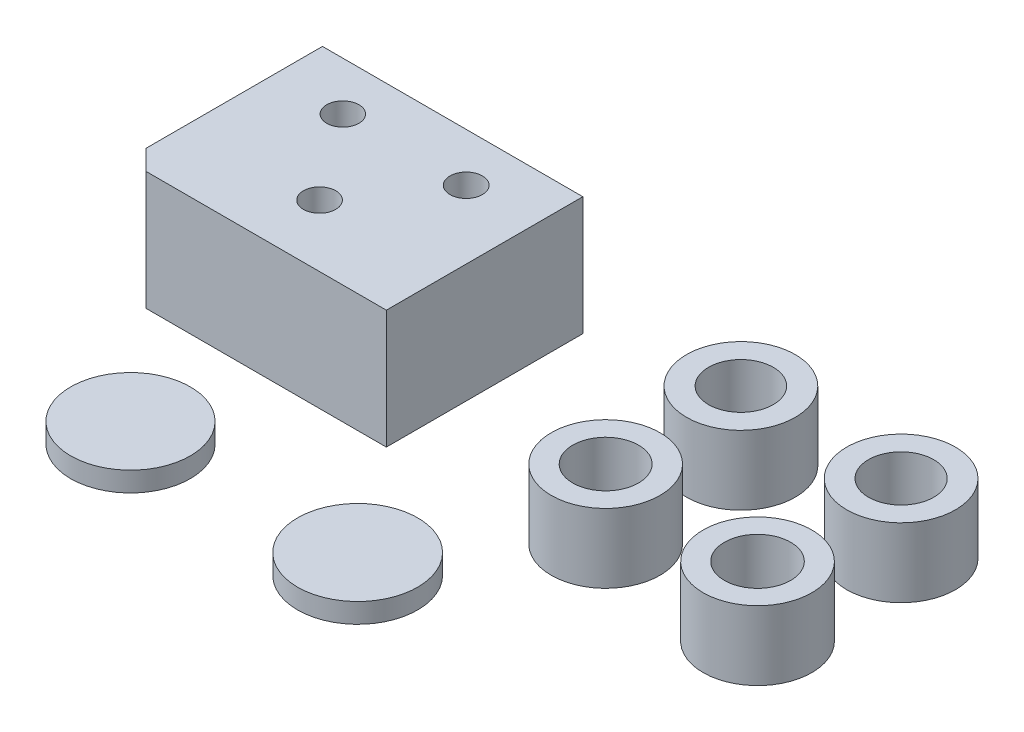
ISO-10303-21;
HEADER;
FILE_DESCRIPTION(('STEP AP214'),'2;1');
FILE_NAME('part.step','',(''),(''),'','','');
FILE_SCHEMA(('AUTOMOTIVE_DESIGN { 1 0 10303 214 1 1 1 1 }'));
ENDSEC;
DATA;
#1=APPLICATION_CONTEXT('core data for automotive mechanical design processes');
#2=APPLICATION_PROTOCOL_DEFINITION('international standard','automotive_design',2000,#1);
#3=PRODUCT_CONTEXT('',#1,'mechanical');
#4=PRODUCT('Part','Part','',(#3));
#5=PRODUCT_RELATED_PRODUCT_CATEGORY('part','',(#4));
#6=PRODUCT_DEFINITION_FORMATION('','',#4);
#7=PRODUCT_DEFINITION_CONTEXT('part definition',#1,'design');
#8=PRODUCT_DEFINITION('design','',#6,#7);
#9=PRODUCT_DEFINITION_SHAPE('','',#8);
#10=(LENGTH_UNIT() NAMED_UNIT(*) SI_UNIT(.MILLI.,.METRE.));
#11=(NAMED_UNIT(*) PLANE_ANGLE_UNIT() SI_UNIT($,.RADIAN.));
#12=(NAMED_UNIT(*) SI_UNIT($,.STERADIAN.) SOLID_ANGLE_UNIT());
#13=UNCERTAINTY_MEASURE_WITH_UNIT(LENGTH_MEASURE(1.E-05),#10,'distance_accuracy_value','');
#14=(GEOMETRIC_REPRESENTATION_CONTEXT(3) GLOBAL_UNCERTAINTY_ASSIGNED_CONTEXT((#13)) GLOBAL_UNIT_ASSIGNED_CONTEXT((#10,
#11,#12)) REPRESENTATION_CONTEXT('',''));
#15=CARTESIAN_POINT('',(0.,0.,0.));
#16=DIRECTION('',(0.,0.,1.));
#17=DIRECTION('',(1.,0.,0.));
#18=AXIS2_PLACEMENT_3D('',#15,#16,#17);
#19=CARTESIAN_POINT('',(36.1092341920358,2.,12.6808861023266));
#20=DIRECTION('',(0.,-1.,0.));
#21=DIRECTION('',(0.,0.,-1.));
#22=AXIS2_PLACEMENT_3D('',#19,#20,#21);
#23=CYLINDRICAL_SURFACE('',#22,6.075);
#24=CARTESIAN_POINT('',(36.1092341920358,2.,12.6808861023266));
#25=DIRECTION('',(0.,1.,0.));
#26=DIRECTION('',(0.,0.,1.));
#27=AXIS2_PLACEMENT_3D('',#24,#25,#26);
#28=CIRCLE('',#27,6.075);
#29=CARTESIAN_POINT('',(36.1092341920358,2.,18.7558861023266));
#30=VERTEX_POINT('',#29);
#31=EDGE_CURVE('E58',#30,#30,#28,.T.);
#32=ORIENTED_EDGE('',*,*,#31,.F.);
#33=EDGE_LOOP('',(#32));
#34=FACE_BOUND('',#33,.T.);
#35=CARTESIAN_POINT('',(36.1092341920358,0.,12.6808861023266));
#36=DIRECTION('',(0.,1.,0.));
#37=DIRECTION('',(0.,0.,1.));
#38=AXIS2_PLACEMENT_3D('',#35,#36,#37);
#39=CIRCLE('',#38,6.075);
#40=CARTESIAN_POINT('',(36.1092341920358,0.,18.7558861023266));
#41=VERTEX_POINT('',#40);
#42=EDGE_CURVE('E11',#41,#41,#39,.T.);
#43=ORIENTED_EDGE('',*,*,#42,.T.);
#44=EDGE_LOOP('',(#43));
#45=FACE_BOUND('',#44,.T.);
#46=ADVANCED_FACE('F54',(#34,#45),#23,.T.);
#47=CARTESIAN_POINT('',(36.1092341920358,2.,12.6808861023266));
#48=DIRECTION('',(0.,1.,0.));
#49=DIRECTION('',(0.,0.,1.));
#50=AXIS2_PLACEMENT_3D('',#47,#48,#49);
#51=PLANE('',#50);
#52=ORIENTED_EDGE('',*,*,#31,.T.);
#53=EDGE_LOOP('',(#52));
#54=FACE_BOUND('',#53,.T.);
#55=ADVANCED_FACE('F56',(#54),#51,.T.);
#56=CARTESIAN_POINT('',(36.1092341920358,0.,12.6808861023266));
#57=DIRECTION('',(0.,1.,0.));
#58=DIRECTION('',(0.,0.,1.));
#59=AXIS2_PLACEMENT_3D('',#56,#57,#58);
#60=PLANE('',#59);
#61=ORIENTED_EDGE('',*,*,#42,.F.);
#62=EDGE_LOOP('',(#61));
#63=FACE_BOUND('',#62,.T.);
#64=ADVANCED_FACE('F73',(#63),#60,.F.);
#65=CLOSED_SHELL('',(#46,#55,#64));
#66=MANIFOLD_SOLID_BREP('B2',#65);
#67=CARTESIAN_POINT('',(13.135466649031,2.,12.6808861023266));
#68=DIRECTION('',(0.,-1.,0.));
#69=DIRECTION('',(0.,0.,-1.));
#70=AXIS2_PLACEMENT_3D('',#67,#68,#69);
#71=CYLINDRICAL_SURFACE('',#70,6.05);
#72=CARTESIAN_POINT('',(13.135466649031,2.,12.6808861023266));
#73=DIRECTION('',(0.,1.,0.));
#74=DIRECTION('',(0.,0.,1.));
#75=AXIS2_PLACEMENT_3D('',#72,#73,#74);
#76=CIRCLE('',#75,6.05);
#77=CARTESIAN_POINT('',(13.135466649031,2.,18.7308861023266));
#78=VERTEX_POINT('',#77);
#79=EDGE_CURVE('E53',#78,#78,#76,.T.);
#80=ORIENTED_EDGE('',*,*,#79,.F.);
#81=EDGE_LOOP('',(#80));
#82=FACE_BOUND('',#81,.T.);
#83=CARTESIAN_POINT('',(13.135466649031,0.,12.6808861023266));
#84=DIRECTION('',(0.,1.,0.));
#85=DIRECTION('',(0.,0.,1.));
#86=AXIS2_PLACEMENT_3D('',#83,#84,#85);
#87=CIRCLE('',#86,6.05);
#88=CARTESIAN_POINT('',(13.135466649031,0.,18.7308861023266));
#89=VERTEX_POINT('',#88);
#90=EDGE_CURVE('E106',#89,#89,#87,.T.);
#91=ORIENTED_EDGE('',*,*,#90,.T.);
#92=EDGE_LOOP('',(#91));
#93=FACE_BOUND('',#92,.T.);
#94=ADVANCED_FACE('F103',(#82,#93),#71,.T.);
#95=CARTESIAN_POINT('',(13.135466649031,2.,12.6808861023266));
#96=DIRECTION('',(0.,1.,0.));
#97=DIRECTION('',(0.,0.,1.));
#98=AXIS2_PLACEMENT_3D('',#95,#96,#97);
#99=PLANE('',#98);
#100=ORIENTED_EDGE('',*,*,#79,.T.);
#101=EDGE_LOOP('',(#100));
#102=FACE_BOUND('',#101,.T.);
#103=ADVANCED_FACE('F118',(#102),#99,.T.);
#104=CARTESIAN_POINT('',(13.135466649031,0.,12.6808861023266));
#105=DIRECTION('',(0.,1.,0.));
#106=DIRECTION('',(0.,0.,1.));
#107=AXIS2_PLACEMENT_3D('',#104,#105,#106);
#108=PLANE('',#107);
#109=ORIENTED_EDGE('',*,*,#90,.F.);
#110=EDGE_LOOP('',(#109));
#111=FACE_BOUND('',#110,.T.);
#112=ADVANCED_FACE('F116',(#111),#108,.F.);
#113=CLOSED_SHELL('',(#94,#103,#112));
#114=MANIFOLD_SOLID_BREP('B6',#113);
#115=CARTESIAN_POINT('',(62.1088451230157,7.,-1.76775751652251));
#116=DIRECTION('',(0.,1.,0.));
#117=DIRECTION('',(0.,0.,1.));
#118=AXIS2_PLACEMENT_3D('',#115,#116,#117);
#119=PLANE('',#118);
#120=CARTESIAN_POINT('',(62.1088451230157,7.,-1.76775751652251));
#121=DIRECTION('',(0.,1.,0.));
#122=DIRECTION('',(0.,0.,1.));
#123=AXIS2_PLACEMENT_3D('',#120,#121,#122);
#124=CIRCLE('',#123,5.5);
#125=CARTESIAN_POINT('',(62.1088451230157,7.,3.73224248347748));
#126=VERTEX_POINT('',#125);
#127=EDGE_CURVE('E171',#126,#126,#124,.T.);
#128=ORIENTED_EDGE('',*,*,#127,.T.);
#129=EDGE_LOOP('',(#128));
#130=FACE_BOUND('',#129,.T.);
#131=CARTESIAN_POINT('',(62.1088451230157,7.,-1.76775751652251));
#132=DIRECTION('',(0.,1.,0.));
#133=DIRECTION('',(0.,0.,1.));
#134=AXIS2_PLACEMENT_3D('',#131,#132,#133);
#135=CIRCLE('',#134,3.34999999999999);
#136=CARTESIAN_POINT('',(62.1088451230157,7.,1.58224248347748));
#137=VERTEX_POINT('',#136);
#138=EDGE_CURVE('E164',#137,#137,#135,.T.);
#139=ORIENTED_EDGE('',*,*,#138,.F.);
#140=EDGE_LOOP('',(#139));
#141=FACE_BOUND('',#140,.T.);
#142=ADVANCED_FACE('F152',(#130,#141),#119,.T.);
#143=CARTESIAN_POINT('',(62.1088451230157,0.,-1.76775751652251));
#144=DIRECTION('',(0.,1.,0.));
#145=DIRECTION('',(0.,0.,1.));
#146=AXIS2_PLACEMENT_3D('',#143,#144,#145);
#147=PLANE('',#146);
#148=CARTESIAN_POINT('',(62.1088451230157,0.,-1.76775751652251));
#149=DIRECTION('',(0.,1.,0.));
#150=DIRECTION('',(0.,0.,1.));
#151=AXIS2_PLACEMENT_3D('',#148,#149,#150);
#152=CIRCLE('',#151,3.84999999999999);
#153=CARTESIAN_POINT('',(62.1088451230157,0.,2.08224248347748));
#154=VERTEX_POINT('',#153);
#155=EDGE_CURVE('E160',#154,#154,#152,.T.);
#156=ORIENTED_EDGE('',*,*,#155,.T.);
#157=EDGE_LOOP('',(#156));
#158=FACE_BOUND('',#157,.T.);
#159=CARTESIAN_POINT('',(62.1088451230157,0.,-1.76775751652251));
#160=DIRECTION('',(0.,1.,0.));
#161=DIRECTION('',(0.,0.,1.));
#162=AXIS2_PLACEMENT_3D('',#159,#160,#161);
#163=CIRCLE('',#162,5.5);
#164=CARTESIAN_POINT('',(62.1088451230157,0.,3.73224248347748));
#165=VERTEX_POINT('',#164);
#166=EDGE_CURVE('E168',#165,#165,#163,.T.);
#167=ORIENTED_EDGE('',*,*,#166,.F.);
#168=EDGE_LOOP('',(#167));
#169=FACE_BOUND('',#168,.T.);
#170=ADVANCED_FACE('F179',(#158,#169),#147,.F.);
#171=CARTESIAN_POINT('',(62.1088451230157,7.,-1.76775751652251));
#172=DIRECTION('',(0.,-1.,0.));
#173=DIRECTION('',(0.,0.,-1.));
#174=AXIS2_PLACEMENT_3D('',#171,#172,#173);
#175=CYLINDRICAL_SURFACE('',#174,5.5);
#176=ORIENTED_EDGE('',*,*,#127,.F.);
#177=EDGE_LOOP('',(#176));
#178=FACE_BOUND('',#177,.T.);
#179=ORIENTED_EDGE('',*,*,#166,.T.);
#180=EDGE_LOOP('',(#179));
#181=FACE_BOUND('',#180,.T.);
#182=ADVANCED_FACE('F177',(#178,#181),#175,.T.);
#183=CARTESIAN_POINT('',(62.1088451230157,7.,-1.76775751652251));
#184=DIRECTION('',(0.,-1.,0.));
#185=DIRECTION('',(0.,0.,-1.));
#186=AXIS2_PLACEMENT_3D('',#183,#184,#185);
#187=CYLINDRICAL_SURFACE('',#186,3.34999999999999);
#188=CARTESIAN_POINT('',(62.1088451230157,0.500000000000001,-1.76775751652251));
#189=DIRECTION('',(0.,1.,0.));
#190=DIRECTION('',(0.,0.,1.));
#191=AXIS2_PLACEMENT_3D('',#188,#189,#190);
#192=CIRCLE('',#191,3.34999999999999);
#193=CARTESIAN_POINT('',(62.1088451230157,0.500000000000001,1.58224248347748));
#194=VERTEX_POINT('',#193);
#195=EDGE_CURVE('E102',#194,#194,#192,.F.);
#196=ORIENTED_EDGE('',*,*,#195,.T.);
#197=EDGE_LOOP('',(#196));
#198=FACE_BOUND('',#197,.T.);
#199=ORIENTED_EDGE('',*,*,#138,.T.);
#200=EDGE_LOOP('',(#199));
#201=FACE_BOUND('',#200,.T.);
#202=ADVANCED_FACE('F186',(#198,#201),#187,.F.);
#203=CARTESIAN_POINT('',(62.1088451230157,0.,-1.76775751652251));
#204=DIRECTION('',(0.,-1.,0.));
#205=DIRECTION('',(0.,0.,-1.));
#206=AXIS2_PLACEMENT_3D('',#203,#204,#205);
#207=CONICAL_SURFACE('',#206,3.84999999999999,0.785398163397447);
#208=ORIENTED_EDGE('',*,*,#195,.F.);
#209=EDGE_LOOP('',(#208));
#210=FACE_BOUND('',#209,.T.);
#211=ORIENTED_EDGE('',*,*,#155,.F.);
#212=EDGE_LOOP('',(#211));
#213=FACE_BOUND('',#212,.T.);
#214=ADVANCED_FACE('F155',(#210,#213),#207,.F.);
#215=CLOSED_SHELL('',(#142,#170,#182,#202,#214));
#216=MANIFOLD_SOLID_BREP('B48',#215);
#217=CARTESIAN_POINT('',(45.9049153053149,7.,-2.60852745989378));
#218=DIRECTION('',(0.,1.,0.));
#219=DIRECTION('',(0.,0.,1.));
#220=AXIS2_PLACEMENT_3D('',#217,#218,#219);
#221=PLANE('',#220);
#222=CARTESIAN_POINT('',(45.9049153053149,7.,-2.60852745989378));
#223=DIRECTION('',(0.,1.,0.));
#224=DIRECTION('',(0.,0.,1.));
#225=AXIS2_PLACEMENT_3D('',#222,#223,#224);
#226=CIRCLE('',#225,5.5);
#227=CARTESIAN_POINT('',(45.9049153053149,7.,2.89147254010621));
#228=VERTEX_POINT('',#227);
#229=EDGE_CURVE('E259',#228,#228,#226,.T.);
#230=ORIENTED_EDGE('',*,*,#229,.T.);
#231=EDGE_LOOP('',(#230));
#232=FACE_BOUND('',#231,.T.);
#233=CARTESIAN_POINT('',(45.9049153053149,7.,-2.60852745989378));
#234=DIRECTION('',(0.,1.,0.));
#235=DIRECTION('',(0.,0.,1.));
#236=AXIS2_PLACEMENT_3D('',#233,#234,#235);
#237=CIRCLE('',#236,3.325);
#238=CARTESIAN_POINT('',(45.9049153053149,7.,0.716472540106221));
#239=VERTEX_POINT('',#238);
#240=EDGE_CURVE('E252',#239,#239,#237,.T.);
#241=ORIENTED_EDGE('',*,*,#240,.F.);
#242=EDGE_LOOP('',(#241));
#243=FACE_BOUND('',#242,.T.);
#244=ADVANCED_FACE('F240',(#232,#243),#221,.T.);
#245=CARTESIAN_POINT('',(45.9049153053149,0.,-2.60852745989378));
#246=DIRECTION('',(0.,1.,0.));
#247=DIRECTION('',(0.,0.,1.));
#248=AXIS2_PLACEMENT_3D('',#245,#246,#247);
#249=PLANE('',#248);
#250=CARTESIAN_POINT('',(45.9049153053149,0.,-2.60852745989378));
#251=DIRECTION('',(0.,1.,0.));
#252=DIRECTION('',(0.,0.,1.));
#253=AXIS2_PLACEMENT_3D('',#250,#251,#252);
#254=CIRCLE('',#253,3.825);
#255=CARTESIAN_POINT('',(45.9049153053149,0.,1.21647254010622));
#256=VERTEX_POINT('',#255);
#257=EDGE_CURVE('E248',#256,#256,#254,.T.);
#258=ORIENTED_EDGE('',*,*,#257,.T.);
#259=EDGE_LOOP('',(#258));
#260=FACE_BOUND('',#259,.T.);
#261=CARTESIAN_POINT('',(45.9049153053149,0.,-2.60852745989378));
#262=DIRECTION('',(0.,1.,0.));
#263=DIRECTION('',(0.,0.,1.));
#264=AXIS2_PLACEMENT_3D('',#261,#262,#263);
#265=CIRCLE('',#264,5.5);
#266=CARTESIAN_POINT('',(45.9049153053149,0.,2.89147254010621));
#267=VERTEX_POINT('',#266);
#268=EDGE_CURVE('E256',#267,#267,#265,.T.);
#269=ORIENTED_EDGE('',*,*,#268,.F.);
#270=EDGE_LOOP('',(#269));
#271=FACE_BOUND('',#270,.T.);
#272=ADVANCED_FACE('F267',(#260,#271),#249,.F.);
#273=CARTESIAN_POINT('',(45.9049153053149,7.,-2.60852745989378));
#274=DIRECTION('',(0.,-1.,0.));
#275=DIRECTION('',(0.,0.,-1.));
#276=AXIS2_PLACEMENT_3D('',#273,#274,#275);
#277=CYLINDRICAL_SURFACE('',#276,5.5);
#278=ORIENTED_EDGE('',*,*,#229,.F.);
#279=EDGE_LOOP('',(#278));
#280=FACE_BOUND('',#279,.T.);
#281=ORIENTED_EDGE('',*,*,#268,.T.);
#282=EDGE_LOOP('',(#281));
#283=FACE_BOUND('',#282,.T.);
#284=ADVANCED_FACE('F265',(#280,#283),#277,.T.);
#285=CARTESIAN_POINT('',(45.9049153053149,7.,-2.60852745989378));
#286=DIRECTION('',(0.,-1.,0.));
#287=DIRECTION('',(0.,0.,-1.));
#288=AXIS2_PLACEMENT_3D('',#285,#286,#287);
#289=CYLINDRICAL_SURFACE('',#288,3.325);
#290=CARTESIAN_POINT('',(45.9049153053149,0.500000000000001,-2.60852745989378));
#291=DIRECTION('',(0.,1.,0.));
#292=DIRECTION('',(0.,0.,1.));
#293=AXIS2_PLACEMENT_3D('',#290,#291,#292);
#294=CIRCLE('',#293,3.325);
#295=CARTESIAN_POINT('',(45.9049153053149,0.500000000000001,0.716472540106221));
#296=VERTEX_POINT('',#295);
#297=EDGE_CURVE('E151',#296,#296,#294,.F.);
#298=ORIENTED_EDGE('',*,*,#297,.T.);
#299=EDGE_LOOP('',(#298));
#300=FACE_BOUND('',#299,.T.);
#301=ORIENTED_EDGE('',*,*,#240,.T.);
#302=EDGE_LOOP('',(#301));
#303=FACE_BOUND('',#302,.T.);
#304=ADVANCED_FACE('F274',(#300,#303),#289,.F.);
#305=CARTESIAN_POINT('',(45.9049153053149,0.,-2.60852745989378));
#306=DIRECTION('',(0.,-1.,0.));
#307=DIRECTION('',(0.,0.,-1.));
#308=AXIS2_PLACEMENT_3D('',#305,#306,#307);
#309=CONICAL_SURFACE('',#308,3.825,0.785398163397447);
#310=ORIENTED_EDGE('',*,*,#297,.F.);
#311=EDGE_LOOP('',(#310));
#312=FACE_BOUND('',#311,.T.);
#313=ORIENTED_EDGE('',*,*,#257,.F.);
#314=EDGE_LOOP('',(#313));
#315=FACE_BOUND('',#314,.T.);
#316=ADVANCED_FACE('F243',(#312,#315),#309,.F.);
#317=CLOSED_SHELL('',(#244,#272,#284,#304,#316));
#318=MANIFOLD_SOLID_BREP('B97',#317);
#319=CARTESIAN_POINT('',(62.1088451230157,7.,-16.2901474474807));
#320=DIRECTION('',(0.,1.,0.));
#321=DIRECTION('',(0.,0.,1.));
#322=AXIS2_PLACEMENT_3D('',#319,#320,#321);
#323=PLANE('',#322);
#324=CARTESIAN_POINT('',(62.1088451230157,7.,-16.2901474474807));
#325=DIRECTION('',(0.,1.,0.));
#326=DIRECTION('',(0.,0.,1.));
#327=AXIS2_PLACEMENT_3D('',#324,#325,#326);
#328=CIRCLE('',#327,5.5);
#329=CARTESIAN_POINT('',(62.1088451230157,7.,-10.7901474474808));
#330=VERTEX_POINT('',#329);
#331=EDGE_CURVE('E347',#330,#330,#328,.T.);
#332=ORIENTED_EDGE('',*,*,#331,.T.);
#333=EDGE_LOOP('',(#332));
#334=FACE_BOUND('',#333,.T.);
#335=CARTESIAN_POINT('',(62.1088451230157,7.,-16.2901474474807));
#336=DIRECTION('',(0.,1.,0.));
#337=DIRECTION('',(0.,0.,1.));
#338=AXIS2_PLACEMENT_3D('',#335,#336,#337);
#339=CIRCLE('',#338,3.3);
#340=CARTESIAN_POINT('',(62.1088451230157,7.,-12.9901474474808));
#341=VERTEX_POINT('',#340);
#342=EDGE_CURVE('E340',#341,#341,#339,.T.);
#343=ORIENTED_EDGE('',*,*,#342,.F.);
#344=EDGE_LOOP('',(#343));
#345=FACE_BOUND('',#344,.T.);
#346=ADVANCED_FACE('F328',(#334,#345),#323,.T.);
#347=CARTESIAN_POINT('',(62.1088451230157,0.,-16.2901474474807));
#348=DIRECTION('',(0.,1.,0.));
#349=DIRECTION('',(0.,0.,1.));
#350=AXIS2_PLACEMENT_3D('',#347,#348,#349);
#351=PLANE('',#350);
#352=CARTESIAN_POINT('',(62.1088451230157,0.,-16.2901474474807));
#353=DIRECTION('',(0.,1.,0.));
#354=DIRECTION('',(0.,0.,1.));
#355=AXIS2_PLACEMENT_3D('',#352,#353,#354);
#356=CIRCLE('',#355,3.8);
#357=CARTESIAN_POINT('',(62.1088451230157,0.,-12.4901474474807));
#358=VERTEX_POINT('',#357);
#359=EDGE_CURVE('E336',#358,#358,#356,.T.);
#360=ORIENTED_EDGE('',*,*,#359,.T.);
#361=EDGE_LOOP('',(#360));
#362=FACE_BOUND('',#361,.T.);
#363=CARTESIAN_POINT('',(62.1088451230157,0.,-16.2901474474807));
#364=DIRECTION('',(0.,1.,0.));
#365=DIRECTION('',(0.,0.,1.));
#366=AXIS2_PLACEMENT_3D('',#363,#364,#365);
#367=CIRCLE('',#366,5.5);
#368=CARTESIAN_POINT('',(62.1088451230157,0.,-10.7901474474808));
#369=VERTEX_POINT('',#368);
#370=EDGE_CURVE('E344',#369,#369,#367,.T.);
#371=ORIENTED_EDGE('',*,*,#370,.F.);
#372=EDGE_LOOP('',(#371));
#373=FACE_BOUND('',#372,.T.);
#374=ADVANCED_FACE('F355',(#362,#373),#351,.F.);
#375=CARTESIAN_POINT('',(62.1088451230157,7.,-16.2901474474807));
#376=DIRECTION('',(0.,-1.,0.));
#377=DIRECTION('',(0.,0.,-1.));
#378=AXIS2_PLACEMENT_3D('',#375,#376,#377);
#379=CYLINDRICAL_SURFACE('',#378,5.5);
#380=ORIENTED_EDGE('',*,*,#331,.F.);
#381=EDGE_LOOP('',(#380));
#382=FACE_BOUND('',#381,.T.);
#383=ORIENTED_EDGE('',*,*,#370,.T.);
#384=EDGE_LOOP('',(#383));
#385=FACE_BOUND('',#384,.T.);
#386=ADVANCED_FACE('F353',(#382,#385),#379,.T.);
#387=CARTESIAN_POINT('',(62.1088451230157,7.,-16.2901474474807));
#388=DIRECTION('',(0.,-1.,0.));
#389=DIRECTION('',(0.,0.,-1.));
#390=AXIS2_PLACEMENT_3D('',#387,#388,#389);
#391=CYLINDRICAL_SURFACE('',#390,3.3);
#392=CARTESIAN_POINT('',(62.1088451230157,0.500000000000005,-16.2901474474807));
#393=DIRECTION('',(0.,1.,0.));
#394=DIRECTION('',(0.,0.,1.));
#395=AXIS2_PLACEMENT_3D('',#392,#393,#394);
#396=CIRCLE('',#395,3.3);
#397=CARTESIAN_POINT('',(62.1088451230157,0.500000000000005,-12.9901474474808));
#398=VERTEX_POINT('',#397);
#399=EDGE_CURVE('E239',#398,#398,#396,.F.);
#400=ORIENTED_EDGE('',*,*,#399,.T.);
#401=EDGE_LOOP('',(#400));
#402=FACE_BOUND('',#401,.T.);
#403=ORIENTED_EDGE('',*,*,#342,.T.);
#404=EDGE_LOOP('',(#403));
#405=FACE_BOUND('',#404,.T.);
#406=ADVANCED_FACE('F362',(#402,#405),#391,.F.);
#407=CARTESIAN_POINT('',(62.1088451230157,0.,-16.2901474474807));
#408=DIRECTION('',(0.,-1.,0.));
#409=DIRECTION('',(0.,0.,-1.));
#410=AXIS2_PLACEMENT_3D('',#407,#408,#409);
#411=CONICAL_SURFACE('',#410,3.8,0.785398163397443);
#412=ORIENTED_EDGE('',*,*,#399,.F.);
#413=EDGE_LOOP('',(#412));
#414=FACE_BOUND('',#413,.T.);
#415=ORIENTED_EDGE('',*,*,#359,.F.);
#416=EDGE_LOOP('',(#415));
#417=FACE_BOUND('',#416,.T.);
#418=ADVANCED_FACE('F331',(#414,#417),#411,.F.);
#419=CLOSED_SHELL('',(#346,#374,#386,#406,#418));
#420=MANIFOLD_SOLID_BREP('B146',#419);
#421=CARTESIAN_POINT('',(45.9049153053149,7.,-16.2901474474807));
#422=DIRECTION('',(0.,1.,0.));
#423=DIRECTION('',(0.,0.,1.));
#424=AXIS2_PLACEMENT_3D('',#421,#422,#423);
#425=PLANE('',#424);
#426=CARTESIAN_POINT('',(45.9049153053149,7.,-16.2901474474807));
#427=DIRECTION('',(0.,1.,0.));
#428=DIRECTION('',(0.,0.,1.));
#429=AXIS2_PLACEMENT_3D('',#426,#427,#428);
#430=CIRCLE('',#429,5.5);
#431=CARTESIAN_POINT('',(45.9049153053149,7.,-10.7901474474808));
#432=VERTEX_POINT('',#431);
#433=EDGE_CURVE('E429',#432,#432,#430,.T.);
#434=ORIENTED_EDGE('',*,*,#433,.T.);
#435=EDGE_LOOP('',(#434));
#436=FACE_BOUND('',#435,.T.);
#437=CARTESIAN_POINT('',(45.9049153053149,7.,-16.2901474474807));
#438=DIRECTION('',(0.,1.,0.));
#439=DIRECTION('',(0.,0.,1.));
#440=AXIS2_PLACEMENT_3D('',#437,#438,#439);
#441=CIRCLE('',#440,3.275);
#442=CARTESIAN_POINT('',(45.9049153053149,7.,-13.0151474474807));
#443=VERTEX_POINT('',#442);
#444=EDGE_CURVE('E437',#443,#443,#441,.T.);
#445=ORIENTED_EDGE('',*,*,#444,.F.);
#446=EDGE_LOOP('',(#445));
#447=FACE_BOUND('',#446,.T.);
#448=ADVANCED_FACE('F417',(#436,#447),#425,.T.);
#449=CARTESIAN_POINT('',(45.9049153053149,0.,-16.2901474474807));
#450=DIRECTION('',(0.,1.,0.));
#451=DIRECTION('',(0.,0.,1.));
#452=AXIS2_PLACEMENT_3D('',#449,#450,#451);
#453=PLANE('',#452);
#454=CARTESIAN_POINT('',(45.9049153053149,0.,-16.2901474474807));
#455=DIRECTION('',(0.,1.,0.));
#456=DIRECTION('',(0.,0.,1.));
#457=AXIS2_PLACEMENT_3D('',#454,#455,#456);
#458=CIRCLE('',#457,3.775);
#459=CARTESIAN_POINT('',(45.9049153053149,0.,-12.5151474474808));
#460=VERTEX_POINT('',#459);
#461=EDGE_CURVE('E425',#460,#460,#458,.T.);
#462=ORIENTED_EDGE('',*,*,#461,.T.);
#463=EDGE_LOOP('',(#462));
#464=FACE_BOUND('',#463,.T.);
#465=CARTESIAN_POINT('',(45.9049153053149,0.,-16.2901474474807));
#466=DIRECTION('',(0.,1.,0.));
#467=DIRECTION('',(0.,0.,1.));
#468=AXIS2_PLACEMENT_3D('',#465,#466,#467);
#469=CIRCLE('',#468,5.5);
#470=CARTESIAN_POINT('',(45.9049153053149,0.,-10.7901474474808));
#471=VERTEX_POINT('',#470);
#472=EDGE_CURVE('E433',#471,#471,#469,.T.);
#473=ORIENTED_EDGE('',*,*,#472,.F.);
#474=EDGE_LOOP('',(#473));
#475=FACE_BOUND('',#474,.T.);
#476=ADVANCED_FACE('F445',(#464,#475),#453,.F.);
#477=CARTESIAN_POINT('',(45.9049153053149,7.,-16.2901474474807));
#478=DIRECTION('',(0.,-1.,0.));
#479=DIRECTION('',(0.,0.,-1.));
#480=AXIS2_PLACEMENT_3D('',#477,#478,#479);
#481=CYLINDRICAL_SURFACE('',#480,5.5);
#482=ORIENTED_EDGE('',*,*,#433,.F.);
#483=EDGE_LOOP('',(#482));
#484=FACE_BOUND('',#483,.T.);
#485=ORIENTED_EDGE('',*,*,#472,.T.);
#486=EDGE_LOOP('',(#485));
#487=FACE_BOUND('',#486,.T.);
#488=ADVANCED_FACE('F452',(#484,#487),#481,.T.);
#489=CARTESIAN_POINT('',(45.9049153053149,7.,-16.2901474474807));
#490=DIRECTION('',(0.,-1.,0.));
#491=DIRECTION('',(0.,0.,-1.));
#492=AXIS2_PLACEMENT_3D('',#489,#490,#491);
#493=CYLINDRICAL_SURFACE('',#492,3.275);
#494=CARTESIAN_POINT('',(45.9049153053149,0.500000000000003,-16.2901474474807));
#495=DIRECTION('',(0.,1.,0.));
#496=DIRECTION('',(0.,0.,1.));
#497=AXIS2_PLACEMENT_3D('',#494,#495,#496);
#498=CIRCLE('',#497,3.275);
#499=CARTESIAN_POINT('',(45.9049153053149,0.500000000000003,-13.0151474474807));
#500=VERTEX_POINT('',#499);
#501=EDGE_CURVE('E327',#500,#500,#498,.F.);
#502=ORIENTED_EDGE('',*,*,#501,.T.);
#503=EDGE_LOOP('',(#502));
#504=FACE_BOUND('',#503,.T.);
#505=ORIENTED_EDGE('',*,*,#444,.T.);
#506=EDGE_LOOP('',(#505));
#507=FACE_BOUND('',#506,.T.);
#508=ADVANCED_FACE('F442',(#504,#507),#493,.F.);
#509=CARTESIAN_POINT('',(45.9049153053149,0.,-16.2901474474807));
#510=DIRECTION('',(0.,-1.,0.));
#511=DIRECTION('',(0.,0.,-1.));
#512=AXIS2_PLACEMENT_3D('',#509,#510,#511);
#513=CONICAL_SURFACE('',#512,3.775,0.785398163397443);
#514=ORIENTED_EDGE('',*,*,#501,.F.);
#515=EDGE_LOOP('',(#514));
#516=FACE_BOUND('',#515,.T.);
#517=ORIENTED_EDGE('',*,*,#461,.F.);
#518=EDGE_LOOP('',(#517));
#519=FACE_BOUND('',#518,.T.);
#520=ADVANCED_FACE('F420',(#516,#519),#513,.F.);
#521=CLOSED_SHELL('',(#448,#476,#488,#508,#520));
#522=MANIFOLD_SOLID_BREP('B234',#521);
#523=CARTESIAN_POINT('',(0.,12.,0.));
#524=DIRECTION('',(0.,-1.,0.));
#525=DIRECTION('',(0.,0.,-1.));
#526=AXIS2_PLACEMENT_3D('',#523,#524,#525);
#527=PLANE('',#526);
#528=DIRECTION('',(0.,0.,-1.));
#529=VECTOR('',#528,1.);
#530=CARTESIAN_POINT('',(26.3332284612097,12.,0.));
#531=LINE('',#530,#529);
#532=CARTESIAN_POINT('',(26.3332284612097,12.,0.));
#533=VERTEX_POINT('',#532);
#534=CARTESIAN_POINT('',(26.3332284612097,12.,-19.8722876491657));
#535=VERTEX_POINT('',#534);
#536=EDGE_CURVE('E594',#533,#535,#531,.T.);
#537=ORIENTED_EDGE('',*,*,#536,.T.);
#538=DIRECTION('',(-1.,0.,0.));
#539=VECTOR('',#538,1.);
#540=CARTESIAN_POINT('',(0.,12.,-19.8722876491657));
#541=LINE('',#540,#539);
#542=CARTESIAN_POINT('',(0.,12.,-19.8722876491657));
#543=VERTEX_POINT('',#542);
#544=EDGE_CURVE('E551',#535,#543,#541,.T.);
#545=ORIENTED_EDGE('',*,*,#544,.T.);
#546=DIRECTION('',(0.,0.,1.));
#547=VECTOR('',#546,1.);
#548=CARTESIAN_POINT('',(0.,12.,-2.));
#549=LINE('',#548,#547);
#550=CARTESIAN_POINT('',(0.,12.,-2.));
#551=VERTEX_POINT('',#550);
#552=EDGE_CURVE('E555',#543,#551,#549,.T.);
#553=ORIENTED_EDGE('',*,*,#552,.T.);
#554=DIRECTION('',(0.707106781186548,0.,0.707106781186548));
#555=VECTOR('',#554,1.);
#556=CARTESIAN_POINT('',(0.,12.,-2.));
#557=LINE('',#556,#555);
#558=CARTESIAN_POINT('',(2.,12.,0.));
#559=VERTEX_POINT('',#558);
#560=EDGE_CURVE('E559',#551,#559,#557,.T.);
#561=ORIENTED_EDGE('',*,*,#560,.T.);
#562=DIRECTION('',(1.,0.,0.));
#563=VECTOR('',#562,1.);
#564=CARTESIAN_POINT('',(2.,12.,0.));
#565=LINE('',#564,#563);
#566=EDGE_CURVE('E516',#559,#533,#565,.T.);
#567=ORIENTED_EDGE('',*,*,#566,.T.);
#568=EDGE_LOOP('',(#537,#545,#553,#561,#567));
#569=FACE_BOUND('',#568,.T.);
#570=CARTESIAN_POINT('',(6.95040602507764,12.,-14.9776355188293));
#571=DIRECTION('',(0.,1.,0.));
#572=DIRECTION('',(0.,0.,1.));
#573=AXIS2_PLACEMENT_3D('',#570,#571,#572);
#574=CIRCLE('',#573,1.63);
#575=CARTESIAN_POINT('',(6.95040602507764,12.,-13.3476355188293));
#576=VERTEX_POINT('',#575);
#577=EDGE_CURVE('E585',#576,#576,#574,.T.);
#578=ORIENTED_EDGE('',*,*,#577,.F.);
#579=EDGE_LOOP('',(#578));
#580=FACE_BOUND('',#579,.T.);
#581=CARTESIAN_POINT('',(13.3134537945149,12.,-6.26515472683056));
#582=DIRECTION('',(0.,1.,0.));
#583=DIRECTION('',(0.,0.,1.));
#584=AXIS2_PLACEMENT_3D('',#581,#582,#583);
#585=CIRCLE('',#584,1.635);
#586=CARTESIAN_POINT('',(13.3134537945149,12.,-4.63015472683056));
#587=VERTEX_POINT('',#586);
#588=EDGE_CURVE('E745',#587,#587,#585,.T.);
#589=ORIENTED_EDGE('',*,*,#588,.F.);
#590=EDGE_LOOP('',(#589));
#591=FACE_BOUND('',#590,.T.);
#592=CARTESIAN_POINT('',(19.4317689574354,12.,-14.9776355188293));
#593=DIRECTION('',(0.,1.,0.));
#594=DIRECTION('',(0.,0.,1.));
#595=AXIS2_PLACEMENT_3D('',#592,#593,#594);
#596=CIRCLE('',#595,1.64);
#597=CARTESIAN_POINT('',(19.4317689574354,12.,-13.3376355188293));
#598=VERTEX_POINT('',#597);
#599=EDGE_CURVE('E748',#598,#598,#596,.T.);
#600=ORIENTED_EDGE('',*,*,#599,.F.);
#601=EDGE_LOOP('',(#600));
#602=FACE_BOUND('',#601,.T.);
#603=ADVANCED_FACE('F497',(#569,#580,#591,#602),#527,.F.);
#604=CARTESIAN_POINT('',(0.,0.,0.));
#605=DIRECTION('',(0.,-1.,0.));
#606=DIRECTION('',(0.,0.,-1.));
#607=AXIS2_PLACEMENT_3D('',#604,#605,#606);
#608=PLANE('',#607);
#609=CARTESIAN_POINT('',(6.95040602507764,0.,-14.9776355188293));
#610=DIRECTION('',(0.,-1.,0.));
#611=DIRECTION('',(0.,0.,-1.));
#612=AXIS2_PLACEMENT_3D('',#609,#610,#611);
#613=CIRCLE('',#612,2.13);
#614=CARTESIAN_POINT('',(6.95040602507764,0.,-17.1076355188293));
#615=VERTEX_POINT('',#614);
#616=EDGE_CURVE('E612',#615,#615,#613,.F.);
#617=ORIENTED_EDGE('',*,*,#616,.T.);
#618=EDGE_LOOP('',(#617));
#619=FACE_BOUND('',#618,.T.);
#620=CARTESIAN_POINT('',(19.4317689574354,0.,-14.9776355188293));
#621=DIRECTION('',(0.,-1.,0.));
#622=DIRECTION('',(0.,0.,-1.));
#623=AXIS2_PLACEMENT_3D('',#620,#621,#622);
#624=CIRCLE('',#623,2.14);
#625=CARTESIAN_POINT('',(19.4317689574354,0.,-17.1176355188293));
#626=VERTEX_POINT('',#625);
#627=EDGE_CURVE('E608',#626,#626,#624,.F.);
#628=ORIENTED_EDGE('',*,*,#627,.T.);
#629=EDGE_LOOP('',(#628));
#630=FACE_BOUND('',#629,.T.);
#631=CARTESIAN_POINT('',(13.3134537945149,0.,-6.26515472683056));
#632=DIRECTION('',(0.,-1.,0.));
#633=DIRECTION('',(0.,0.,-1.));
#634=AXIS2_PLACEMENT_3D('',#631,#632,#633);
#635=CIRCLE('',#634,2.13499999999999);
#636=CARTESIAN_POINT('',(13.3134537945149,0.,-8.40015472683055));
#637=VERTEX_POINT('',#636);
#638=EDGE_CURVE('E604',#637,#637,#635,.F.);
#639=ORIENTED_EDGE('',*,*,#638,.T.);
#640=EDGE_LOOP('',(#639));
#641=FACE_BOUND('',#640,.T.);
#642=DIRECTION('',(0.,0.,-1.));
#643=VECTOR('',#642,1.);
#644=CARTESIAN_POINT('',(26.3332284612097,0.,0.));
#645=LINE('',#644,#643);
#646=CARTESIAN_POINT('',(26.3332284612097,0.,0.));
#647=VERTEX_POINT('',#646);
#648=CARTESIAN_POINT('',(26.3332284612097,0.,-19.8722876491657));
#649=VERTEX_POINT('',#648);
#650=EDGE_CURVE('E580',#647,#649,#645,.T.);
#651=ORIENTED_EDGE('',*,*,#650,.F.);
#652=DIRECTION('',(1.,0.,0.));
#653=VECTOR('',#652,1.);
#654=CARTESIAN_POINT('',(2.,0.,0.));
#655=LINE('',#654,#653);
#656=CARTESIAN_POINT('',(2.,0.,0.));
#657=VERTEX_POINT('',#656);
#658=EDGE_CURVE('E542',#657,#647,#655,.T.);
#659=ORIENTED_EDGE('',*,*,#658,.F.);
#660=DIRECTION('',(0.707106781186548,0.,0.707106781186548));
#661=VECTOR('',#660,1.);
#662=CARTESIAN_POINT('',(0.,0.,-2.));
#663=LINE('',#662,#661);
#664=CARTESIAN_POINT('',(0.,0.,-2.));
#665=VERTEX_POINT('',#664);
#666=EDGE_CURVE('E536',#665,#657,#663,.T.);
#667=ORIENTED_EDGE('',*,*,#666,.F.);
#668=DIRECTION('',(0.,0.,1.));
#669=VECTOR('',#668,1.);
#670=CARTESIAN_POINT('',(0.,0.,-2.));
#671=LINE('',#670,#669);
#672=CARTESIAN_POINT('',(0.,0.,-19.8722876491657));
#673=VERTEX_POINT('',#672);
#674=EDGE_CURVE('E567',#673,#665,#671,.T.);
#675=ORIENTED_EDGE('',*,*,#674,.F.);
#676=DIRECTION('',(-1.,0.,0.));
#677=VECTOR('',#676,1.);
#678=CARTESIAN_POINT('',(0.,0.,-19.8722876491657));
#679=LINE('',#678,#677);
#680=EDGE_CURVE('E584',#649,#673,#679,.T.);
#681=ORIENTED_EDGE('',*,*,#680,.F.);
#682=EDGE_LOOP('',(#651,#659,#667,#675,#681));
#683=FACE_BOUND('',#682,.T.);
#684=ADVANCED_FACE('F632',(#619,#630,#641,#683),#608,.T.);
#685=CARTESIAN_POINT('',(26.3332284612097,12.,0.));
#686=DIRECTION('',(-1.,0.,0.));
#687=DIRECTION('',(0.,0.,1.));
#688=AXIS2_PLACEMENT_3D('',#685,#686,#687);
#689=PLANE('',#688);
#690=ORIENTED_EDGE('',*,*,#650,.T.);
#691=DIRECTION('',(0.,-1.,0.));
#692=VECTOR('',#691,1.);
#693=CARTESIAN_POINT('',(26.3332284612097,12.,-19.8722876491657));
#694=LINE('',#693,#692);
#695=EDGE_CURVE('E601',#535,#649,#694,.T.);
#696=ORIENTED_EDGE('',*,*,#695,.F.);
#697=ORIENTED_EDGE('',*,*,#536,.F.);
#698=DIRECTION('',(0.,-1.,0.));
#699=VECTOR('',#698,1.);
#700=CARTESIAN_POINT('',(26.3332284612097,12.,0.));
#701=LINE('',#700,#699);
#702=EDGE_CURVE('E576',#533,#647,#701,.T.);
#703=ORIENTED_EDGE('',*,*,#702,.T.);
#704=EDGE_LOOP('',(#690,#696,#697,#703));
#705=FACE_BOUND('',#704,.T.);
#706=ADVANCED_FACE('F635',(#705),#689,.F.);
#707=CARTESIAN_POINT('',(0.,12.,-19.8722876491657));
#708=DIRECTION('',(0.,0.,1.));
#709=DIRECTION('',(1.,0.,0.));
#710=AXIS2_PLACEMENT_3D('',#707,#708,#709);
#711=PLANE('',#710);
#712=ORIENTED_EDGE('',*,*,#680,.T.);
#713=DIRECTION('',(0.,-1.,0.));
#714=VECTOR('',#713,1.);
#715=CARTESIAN_POINT('',(0.,12.,-19.8722876491657));
#716=LINE('',#715,#714);
#717=EDGE_CURVE('E569',#543,#673,#716,.T.);
#718=ORIENTED_EDGE('',*,*,#717,.F.);
#719=ORIENTED_EDGE('',*,*,#544,.F.);
#720=ORIENTED_EDGE('',*,*,#695,.T.);
#721=EDGE_LOOP('',(#712,#718,#719,#720));
#722=FACE_BOUND('',#721,.T.);
#723=ADVANCED_FACE('F685',(#722),#711,.F.);
#724=CARTESIAN_POINT('',(0.,12.,-2.));
#725=DIRECTION('',(1.,0.,0.));
#726=DIRECTION('',(0.,0.,-1.));
#727=AXIS2_PLACEMENT_3D('',#724,#725,#726);
#728=PLANE('',#727);
#729=ORIENTED_EDGE('',*,*,#674,.T.);
#730=DIRECTION('',(0.,-1.,0.));
#731=VECTOR('',#730,1.);
#732=CARTESIAN_POINT('',(0.,12.,-2.));
#733=LINE('',#732,#731);
#734=EDGE_CURVE('E564',#551,#665,#733,.T.);
#735=ORIENTED_EDGE('',*,*,#734,.F.);
#736=ORIENTED_EDGE('',*,*,#552,.F.);
#737=ORIENTED_EDGE('',*,*,#717,.T.);
#738=EDGE_LOOP('',(#729,#735,#736,#737));
#739=FACE_BOUND('',#738,.T.);
#740=ADVANCED_FACE('F565',(#739),#728,.F.);
#741=CARTESIAN_POINT('',(0.,12.,-2.));
#742=DIRECTION('',(0.707106781186547,0.,-0.707106781186548));
#743=DIRECTION('',(-0.707106781186548,0.,-0.707106781186547));
#744=AXIS2_PLACEMENT_3D('',#741,#742,#743);
#745=PLANE('',#744);
#746=ORIENTED_EDGE('',*,*,#666,.T.);
#747=DIRECTION('',(0.,-1.,0.));
#748=VECTOR('',#747,1.);
#749=CARTESIAN_POINT('',(2.,12.,0.));
#750=LINE('',#749,#748);
#751=EDGE_CURVE('E570',#559,#657,#750,.T.);
#752=ORIENTED_EDGE('',*,*,#751,.F.);
#753=ORIENTED_EDGE('',*,*,#560,.F.);
#754=ORIENTED_EDGE('',*,*,#734,.T.);
#755=EDGE_LOOP('',(#746,#752,#753,#754));
#756=FACE_BOUND('',#755,.T.);
#757=ADVANCED_FACE('F572',(#756),#745,.F.);
#758=CARTESIAN_POINT('',(2.,12.,0.));
#759=DIRECTION('',(0.,0.,-1.));
#760=DIRECTION('',(-1.,0.,0.));
#761=AXIS2_PLACEMENT_3D('',#758,#759,#760);
#762=PLANE('',#761);
#763=ORIENTED_EDGE('',*,*,#658,.T.);
#764=ORIENTED_EDGE('',*,*,#702,.F.);
#765=ORIENTED_EDGE('',*,*,#566,.F.);
#766=ORIENTED_EDGE('',*,*,#751,.T.);
#767=EDGE_LOOP('',(#763,#764,#765,#766));
#768=FACE_BOUND('',#767,.T.);
#769=ADVANCED_FACE('F644',(#768),#762,.F.);
#770=CARTESIAN_POINT('',(6.95040602507764,12.,-14.9776355188293));
#771=DIRECTION('',(0.,-1.,0.));
#772=DIRECTION('',(0.,0.,-1.));
#773=AXIS2_PLACEMENT_3D('',#770,#771,#772);
#774=CYLINDRICAL_SURFACE('',#773,1.63);
#775=CARTESIAN_POINT('',(6.95040602507764,0.500000000000006,-14.9776355188293));
#776=DIRECTION('',(0.,-1.,0.));
#777=DIRECTION('',(0.,0.,-1.));
#778=AXIS2_PLACEMENT_3D('',#775,#776,#777);
#779=CIRCLE('',#778,1.63);
#780=CARTESIAN_POINT('',(6.95040602507764,0.500000000000006,-16.6076355188293));
#781=VERTEX_POINT('',#780);
#782=EDGE_CURVE('E616',#781,#781,#779,.T.);
#783=ORIENTED_EDGE('',*,*,#782,.T.);
#784=EDGE_LOOP('',(#783));
#785=FACE_BOUND('',#784,.T.);
#786=ORIENTED_EDGE('',*,*,#577,.T.);
#787=EDGE_LOOP('',(#786));
#788=FACE_BOUND('',#787,.T.);
#789=ADVANCED_FACE('F646',(#785,#788),#774,.F.);
#790=CARTESIAN_POINT('',(13.3134537945149,12.,-6.26515472683056));
#791=DIRECTION('',(0.,-1.,0.));
#792=DIRECTION('',(0.,0.,-1.));
#793=AXIS2_PLACEMENT_3D('',#790,#791,#792);
#794=CYLINDRICAL_SURFACE('',#793,1.635);
#795=CARTESIAN_POINT('',(13.3134537945149,0.499999999999999,-6.26515472683056));
#796=DIRECTION('',(0.,-1.,0.));
#797=DIRECTION('',(0.,0.,-1.));
#798=AXIS2_PLACEMENT_3D('',#795,#796,#797);
#799=CIRCLE('',#798,1.635);
#800=CARTESIAN_POINT('',(13.3134537945149,0.499999999999999,-7.90015472683055));
#801=VERTEX_POINT('',#800);
#802=EDGE_CURVE('E415',#801,#801,#799,.T.);
#803=ORIENTED_EDGE('',*,*,#802,.T.);
#804=EDGE_LOOP('',(#803));
#805=FACE_BOUND('',#804,.T.);
#806=ORIENTED_EDGE('',*,*,#588,.T.);
#807=EDGE_LOOP('',(#806));
#808=FACE_BOUND('',#807,.T.);
#809=ADVANCED_FACE('F652',(#805,#808),#794,.F.);
#810=CARTESIAN_POINT('',(19.4317689574354,12.,-14.9776355188293));
#811=DIRECTION('',(0.,-1.,0.));
#812=DIRECTION('',(0.,0.,-1.));
#813=AXIS2_PLACEMENT_3D('',#810,#811,#812);
#814=CYLINDRICAL_SURFACE('',#813,1.64);
#815=CARTESIAN_POINT('',(19.4317689574354,0.500000000000004,-14.9776355188293));
#816=DIRECTION('',(0.,-1.,0.));
#817=DIRECTION('',(0.,0.,-1.));
#818=AXIS2_PLACEMENT_3D('',#815,#816,#817);
#819=CIRCLE('',#818,1.64);
#820=CARTESIAN_POINT('',(19.4317689574354,0.500000000000004,-16.6176355188293));
#821=VERTEX_POINT('',#820);
#822=EDGE_CURVE('E508',#821,#821,#819,.T.);
#823=ORIENTED_EDGE('',*,*,#822,.T.);
#824=EDGE_LOOP('',(#823));
#825=FACE_BOUND('',#824,.T.);
#826=ORIENTED_EDGE('',*,*,#599,.T.);
#827=EDGE_LOOP('',(#826));
#828=FACE_BOUND('',#827,.T.);
#829=ADVANCED_FACE('F623',(#825,#828),#814,.F.);
#830=CARTESIAN_POINT('',(6.95040602507764,0.,-14.9776355188293));
#831=DIRECTION('',(0.,-1.,0.));
#832=DIRECTION('',(0.,0.,-1.));
#833=AXIS2_PLACEMENT_3D('',#830,#831,#832);
#834=CONICAL_SURFACE('',#833,2.13,0.785398163397441);
#835=ORIENTED_EDGE('',*,*,#782,.F.);
#836=EDGE_LOOP('',(#835));
#837=FACE_BOUND('',#836,.T.);
#838=ORIENTED_EDGE('',*,*,#616,.F.);
#839=EDGE_LOOP('',(#838));
#840=FACE_BOUND('',#839,.T.);
#841=ADVANCED_FACE('F629',(#837,#840),#834,.F.);
#842=CARTESIAN_POINT('',(19.4317689574354,0.,-14.9776355188293));
#843=DIRECTION('',(0.,-1.,0.));
#844=DIRECTION('',(0.,0.,-1.));
#845=AXIS2_PLACEMENT_3D('',#842,#843,#844);
#846=CONICAL_SURFACE('',#845,2.14,0.785398163397445);
#847=ORIENTED_EDGE('',*,*,#822,.F.);
#848=EDGE_LOOP('',(#847));
#849=FACE_BOUND('',#848,.T.);
#850=ORIENTED_EDGE('',*,*,#627,.F.);
#851=EDGE_LOOP('',(#850));
#852=FACE_BOUND('',#851,.T.);
#853=ADVANCED_FACE('F626',(#849,#852),#846,.F.);
#854=CARTESIAN_POINT('',(13.3134537945149,0.,-6.26515472683056));
#855=DIRECTION('',(0.,-1.,0.));
#856=DIRECTION('',(0.,0.,-1.));
#857=AXIS2_PLACEMENT_3D('',#854,#855,#856);
#858=CONICAL_SURFACE('',#857,2.13499999999999,0.785398163397444);
#859=ORIENTED_EDGE('',*,*,#802,.F.);
#860=EDGE_LOOP('',(#859));
#861=FACE_BOUND('',#860,.T.);
#862=ORIENTED_EDGE('',*,*,#638,.F.);
#863=EDGE_LOOP('',(#862));
#864=FACE_BOUND('',#863,.T.);
#865=ADVANCED_FACE('F500',(#861,#864),#858,.F.);
#866=CLOSED_SHELL('',(#603,#684,#706,#723,#740,#757,#769,#789,#809,#829,#841,#853,#865));
#867=MANIFOLD_SOLID_BREP('B322',#866);
#868=ADVANCED_BREP_SHAPE_REPRESENTATION('',(#18,#66,#114,#216,#318,#420,#522,#867),#14);
#869=SHAPE_DEFINITION_REPRESENTATION(#9,#868);
ENDSEC;
END-ISO-10303-21;
